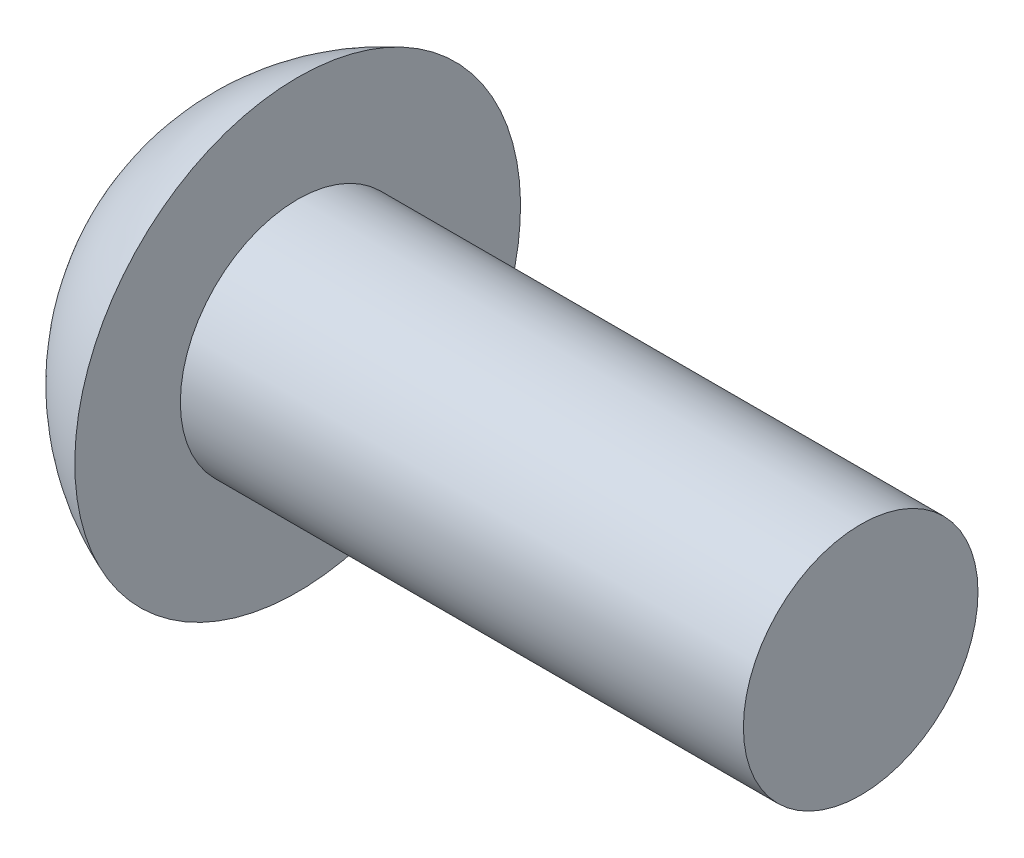
ISO-10303-21;
HEADER;
FILE_DESCRIPTION(('STEP AP214'),'2;1');
FILE_NAME('part.step','',(''),(''),'','','');
FILE_SCHEMA(('AUTOMOTIVE_DESIGN { 1 0 10303 214 1 1 1 1 }'));
ENDSEC;
DATA;
#1=APPLICATION_CONTEXT('core data for automotive mechanical design processes');
#2=APPLICATION_PROTOCOL_DEFINITION('international standard','automotive_design',2000,#1);
#3=PRODUCT_CONTEXT('',#1,'mechanical');
#4=PRODUCT('Part','Part','',(#3));
#5=PRODUCT_RELATED_PRODUCT_CATEGORY('part','',(#4));
#6=PRODUCT_DEFINITION_FORMATION('','',#4);
#7=PRODUCT_DEFINITION_CONTEXT('part definition',#1,'design');
#8=PRODUCT_DEFINITION('design','',#6,#7);
#9=PRODUCT_DEFINITION_SHAPE('','',#8);
#10=(LENGTH_UNIT() NAMED_UNIT(*) SI_UNIT(.MILLI.,.METRE.));
#11=(NAMED_UNIT(*) PLANE_ANGLE_UNIT() SI_UNIT($,.RADIAN.));
#12=(NAMED_UNIT(*) SI_UNIT($,.STERADIAN.) SOLID_ANGLE_UNIT());
#13=UNCERTAINTY_MEASURE_WITH_UNIT(LENGTH_MEASURE(1.E-05),#10,'distance_accuracy_value','');
#14=(GEOMETRIC_REPRESENTATION_CONTEXT(3) GLOBAL_UNCERTAINTY_ASSIGNED_CONTEXT((#13)) GLOBAL_UNIT_ASSIGNED_CONTEXT((#10,
#11,#12)) REPRESENTATION_CONTEXT('',''));
#15=CARTESIAN_POINT('',(0.,0.,0.));
#16=DIRECTION('',(0.,0.,1.));
#17=DIRECTION('',(1.,0.,0.));
#18=AXIS2_PLACEMENT_3D('',#15,#16,#17);
#19=CARTESIAN_POINT('',(0.,0.,0.));
#20=DIRECTION('',(1.,0.,0.));
#21=DIRECTION('',(0.,0.,-1.));
#22=AXIS2_PLACEMENT_3D('',#19,#20,#21);
#23=PLANE('',#22);
#24=CARTESIAN_POINT('',(0.,0.,0.));
#25=DIRECTION('',(-1.,0.,0.));
#26=DIRECTION('',(0.,0.,1.));
#27=AXIS2_PLACEMENT_3D('',#24,#25,#26);
#28=CIRCLE('',#27,2.22);
#29=CARTESIAN_POINT('',(0.,2.22,0.));
#30=VERTEX_POINT('',#29);
#31=EDGE_CURVE('E135',#30,#30,#28,.T.);
#32=ORIENTED_EDGE('',*,*,#31,.T.);
#33=EDGE_LOOP('',(#32));
#34=FACE_BOUND('',#33,.T.);
#35=DIRECTION('',(0.,0.866025403784439,-0.5));
#36=VECTOR('',#35,1.);
#37=CARTESIAN_POINT('',(0.,-1.5,-0.866025403784438));
#38=LINE('',#37,#36);
#39=CARTESIAN_POINT('',(0.,-1.5,-0.866025403784438));
#40=VERTEX_POINT('',#39);
#41=CARTESIAN_POINT('',(0.,0.,-1.73205080756888));
#42=VERTEX_POINT('',#41);
#43=EDGE_CURVE('E61',#40,#42,#38,.T.);
#44=ORIENTED_EDGE('',*,*,#43,.T.);
#45=DIRECTION('',(0.,0.866025403784438,0.5));
#46=VECTOR('',#45,1.);
#47=CARTESIAN_POINT('',(0.,0.,-1.73205080756888));
#48=LINE('',#47,#46);
#49=CARTESIAN_POINT('',(0.,1.5,-0.866025403784437));
#50=VERTEX_POINT('',#49);
#51=EDGE_CURVE('E120',#42,#50,#48,.T.);
#52=ORIENTED_EDGE('',*,*,#51,.T.);
#53=DIRECTION('',(0.,0.,1.));
#54=VECTOR('',#53,1.);
#55=CARTESIAN_POINT('',(0.,1.5,-0.866025403784437));
#56=LINE('',#55,#54);
#57=CARTESIAN_POINT('',(0.,1.5,0.866025403784439));
#58=VERTEX_POINT('',#57);
#59=EDGE_CURVE('E118',#50,#58,#56,.T.);
#60=ORIENTED_EDGE('',*,*,#59,.T.);
#61=DIRECTION('',(0.,-0.866025403784439,0.5));
#62=VECTOR('',#61,1.);
#63=CARTESIAN_POINT('',(0.,1.5,0.866025403784439));
#64=LINE('',#63,#62);
#65=CARTESIAN_POINT('',(0.,0.,1.73205080756888));
#66=VERTEX_POINT('',#65);
#67=EDGE_CURVE('E97',#58,#66,#64,.T.);
#68=ORIENTED_EDGE('',*,*,#67,.T.);
#69=DIRECTION('',(0.,-0.866025403784438,-0.5));
#70=VECTOR('',#69,1.);
#71=CARTESIAN_POINT('',(0.,0.,1.73205080756888));
#72=LINE('',#71,#70);
#73=CARTESIAN_POINT('',(0.,-1.5,0.866025403784439));
#74=VERTEX_POINT('',#73);
#75=EDGE_CURVE('E108',#66,#74,#72,.T.);
#76=ORIENTED_EDGE('',*,*,#75,.T.);
#77=DIRECTION('',(0.,0.,-1.));
#78=VECTOR('',#77,1.);
#79=CARTESIAN_POINT('',(0.,-1.5,0.866025403784439));
#80=LINE('',#79,#78);
#81=EDGE_CURVE('E114',#74,#40,#80,.T.);
#82=ORIENTED_EDGE('',*,*,#81,.T.);
#83=EDGE_LOOP('',(#44,#52,#60,#68,#76,#82));
#84=FACE_BOUND('',#83,.T.);
#85=ADVANCED_FACE('F47',(#34,#84),#23,.F.);
#86=CARTESIAN_POINT('',(2.75,0.,0.));
#87=DIRECTION('',(1.,0.,0.));
#88=DIRECTION('',(0.,0.,-1.));
#89=AXIS2_PLACEMENT_3D('',#86,#87,#88);
#90=PLANE('',#89);
#91=CARTESIAN_POINT('',(2.75,0.,0.));
#92=DIRECTION('',(-1.,0.,0.));
#93=DIRECTION('',(0.,0.,1.));
#94=AXIS2_PLACEMENT_3D('',#91,#92,#93);
#95=CIRCLE('',#94,4.75);
#96=CARTESIAN_POINT('',(2.75,4.75,0.));
#97=VERTEX_POINT('',#96);
#98=EDGE_CURVE('E138',#97,#97,#95,.T.);
#99=ORIENTED_EDGE('',*,*,#98,.F.);
#100=EDGE_LOOP('',(#99));
#101=FACE_BOUND('',#100,.T.);
#102=CARTESIAN_POINT('',(2.75,0.,0.));
#103=DIRECTION('',(1.,0.,0.));
#104=DIRECTION('',(0.,0.,-1.));
#105=AXIS2_PLACEMENT_3D('',#102,#103,#104);
#106=CIRCLE('',#105,2.5);
#107=CARTESIAN_POINT('',(2.75,0.,-2.5));
#108=VERTEX_POINT('',#107);
#109=EDGE_CURVE('E50',#108,#108,#106,.T.);
#110=ORIENTED_EDGE('',*,*,#109,.F.);
#111=EDGE_LOOP('',(#110));
#112=FACE_BOUND('',#111,.T.);
#113=ADVANCED_FACE('F147',(#101,#112),#90,.T.);
#114=CARTESIAN_POINT('',(14.75,0.,0.));
#115=DIRECTION('',(-1.,0.,0.));
#116=DIRECTION('',(0.,0.,1.));
#117=AXIS2_PLACEMENT_3D('',#114,#115,#116);
#118=CYLINDRICAL_SURFACE('',#117,2.5);
#119=CARTESIAN_POINT('',(14.75,0.,0.));
#120=DIRECTION('',(1.,0.,0.));
#121=DIRECTION('',(0.,0.,-1.));
#122=AXIS2_PLACEMENT_3D('',#119,#120,#121);
#123=CIRCLE('',#122,2.5);
#124=CARTESIAN_POINT('',(14.75,0.,-2.5));
#125=VERTEX_POINT('',#124);
#126=EDGE_CURVE('E13',#125,#125,#123,.T.);
#127=ORIENTED_EDGE('',*,*,#126,.F.);
#128=EDGE_LOOP('',(#127));
#129=FACE_BOUND('',#128,.T.);
#130=ORIENTED_EDGE('',*,*,#109,.T.);
#131=EDGE_LOOP('',(#130));
#132=FACE_BOUND('',#131,.T.);
#133=ADVANCED_FACE('F145',(#129,#132),#118,.T.);
#134=CARTESIAN_POINT('',(14.75,0.,0.));
#135=DIRECTION('',(1.,0.,0.));
#136=DIRECTION('',(0.,0.,-1.));
#137=AXIS2_PLACEMENT_3D('',#134,#135,#136);
#138=PLANE('',#137);
#139=ORIENTED_EDGE('',*,*,#126,.T.);
#140=EDGE_LOOP('',(#139));
#141=FACE_BOUND('',#140,.T.);
#142=ADVANCED_FACE('F154',(#141),#138,.T.);
#143=CARTESIAN_POINT('',(4.5812,0.,0.));
#144=DIRECTION('',(-1.,0.,0.));
#145=DIRECTION('',(0.,1.,0.));
#146=AXIS2_PLACEMENT_3D('',#143,#144,#145);
#147=SPHERICAL_SURFACE('',#146,5.09075568457179);
#148=CARTESIAN_POINT('',(2.75,4.75,0.));
#149=CARTESIAN_POINT('',(2.71281165914362,4.7356634067664,0.));
#150=CARTESIAN_POINT('',(2.67579175260739,4.72088991760716,0.));
#151=CARTESIAN_POINT('',(2.60210907410314,4.69047767338159,0.));
#152=CARTESIAN_POINT('',(2.56544630213512,4.67483891831526,0.));
#153=CARTESIAN_POINT('',(2.49249815869515,4.64270466821971,0.));
#154=CARTESIAN_POINT('',(2.45621278722321,4.62620917319048,0.));
#155=CARTESIAN_POINT('',(2.3840394497301,4.59237056961104,0.));
#156=CARTESIAN_POINT('',(2.34815148370892,4.57502746106082,0.));
#157=CARTESIAN_POINT('',(2.27679275699553,4.53950319018149,0.));
#158=CARTESIAN_POINT('',(2.24132199630331,4.52132202785239,0.));
#159=CARTESIAN_POINT('',(2.17081724619298,4.48413168063562,0.));
#160=CARTESIAN_POINT('',(2.13578325677486,4.46512249574795,0.));
#161=CARTESIAN_POINT('',(2.06617137523708,4.42628658893631,0.));
#162=CARTESIAN_POINT('',(2.03159348311743,4.40645986701233,0.));
#163=CARTESIAN_POINT('',(1.96291287033178,4.36599982328776,0.));
#164=CARTESIAN_POINT('',(1.92881014966579,4.34536650148717,0.));
#165=CARTESIAN_POINT('',(1.86109869189659,4.30330463993736,0.));
#166=CARTESIAN_POINT('',(1.82748995479339,4.28187610018814,0.));
#167=CARTESIAN_POINT('',(1.76078500374307,4.23823562338269,0.));
#168=CARTESIAN_POINT('',(1.72768878979595,4.21602368632645,0.));
#169=CARTESIAN_POINT('',(1.66202714193304,4.17082866768159,0.));
#170=CARTESIAN_POINT('',(1.62946170801725,4.14784558609296,0.));
#171=CARTESIAN_POINT('',(1.56487958429648,4.10112095654801,0.));
#172=CARTESIAN_POINT('',(1.5328628944915,4.0773794085917,0.));
#173=CARTESIAN_POINT('',(1.46939592036835,4.02915094286818,0.));
#174=CARTESIAN_POINT('',(1.43794563605018,4.00466402510099,0.));
#175=CARTESIAN_POINT('',(1.37562882183011,3.95495832748135,0.));
#176=CARTESIAN_POINT('',(1.34476229192821,3.9297395476289,0.));
#177=CARTESIAN_POINT('',(1.28363001345356,3.87858403728161,0.));
#178=CARTESIAN_POINT('',(1.25336426488081,3.85264730678677,0.));
#179=CARTESIAN_POINT('',(1.19345024456815,3.80007020264087,0.));
#180=CARTESIAN_POINT('',(1.16380197282824,3.77342982898982,0.));
#181=CARTESIAN_POINT('',(1.10513926106603,3.71946013416859,0.));
#182=CARTESIAN_POINT('',(1.07612482104372,3.6921308129984,0.));
#183=CARTESIAN_POINT('',(1.01874577796071,3.63679829882028,0.));
#184=CARTESIAN_POINT('',(0.990381174900008,3.60879510581234,0.));
#185=CARTESIAN_POINT('',(0.934317452514436,3.55213029536823,0.));
#186=CARTESIAN_POINT('',(0.906618333189569,3.52346867793205,0.));
#187=CARTESIAN_POINT('',(0.851900857948916,3.46550282924783,0.));
#188=CARTESIAN_POINT('',(0.824882502033129,3.43619859799978,0.));
#189=CARTESIAN_POINT('',(0.771541457754219,3.37696368679339,0.));
#190=CARTESIAN_POINT('',(0.745218769391096,3.34703300683506,0.));
#191=CARTESIAN_POINT('',(0.693283580609569,3.28656170887789,0.));
#192=CARTESIAN_POINT('',(0.667671080191165,3.25602109087906,0.));
#193=CARTESIAN_POINT('',(0.617170395930826,3.19434676397053,0.));
#194=CARTESIAN_POINT('',(0.59228221208889,3.16321305506084,0.));
#195=CARTESIAN_POINT('',(0.543243890055002,3.10036972062883,0.));
#196=CARTESIAN_POINT('',(0.51909375186305,3.06866009510651,0.));
#197=CARTESIAN_POINT('',(0.471544843086512,3.00468241943424,0.));
#198=CARTESIAN_POINT('',(0.448146072501926,2.9724143692843,0.));
#199=CARTESIAN_POINT('',(0.402112806374826,2.90733764440914,0.));
#200=CARTESIAN_POINT('',(0.379478310832312,2.87452896968392,0.));
#201=CARTESIAN_POINT('',(0.334986080796769,2.80838909384811,0.));
#202=CARTESIAN_POINT('',(0.313128346303741,2.77505789273752,0.));
#203=CARTESIAN_POINT('',(0.270201695255319,2.70789135088823,0.));
#204=CARTESIAN_POINT('',(0.249132778699925,2.67405601014954,0.));
#205=CARTESIAN_POINT('',(0.207795387646451,2.60589985268335,0.));
#206=CARTESIAN_POINT('',(0.187526913148371,2.57157903595585,0.));
#207=CARTESIAN_POINT('',(0.147801579945857,2.50247086249532,0.));
#208=CARTESIAN_POINT('',(0.128344721241424,2.46768350576228,0.));
#209=CARTESIAN_POINT('',(0.0902533786243306,2.39766142868534,0.));
#210=CARTESIAN_POINT('',(0.07161889471167,2.36242670834144,0.));
#211=CARTESIAN_POINT('',(0.0351824839700637,2.29152939046082,0.));
#212=CARTESIAN_POINT('',(0.017380557141118,2.2558667929241,0.));
#213=CARTESIAN_POINT('',(0.,2.22,0.));
#214=B_SPLINE_CURVE_WITH_KNOTS('',3,(#148,#149,#150,#151,#152,#153,#154,#155,#156,#157,#158,
#159,#160,#161,#162,#163,#164,#165,#166,#167,#168,#169,#170,#171,#172,#173,#174,#175,#176,#177,
#178,#179,#180,#181,#182,#183,#184,#185,#186,#187,#188,#189,#190,#191,#192,#193,#194,#195,#196,
#197,#198,#199,#200,#201,#202,#203,#204,#205,#206,#207,#208,#209,#210,#211,#212,#213),
.UNSPECIFIED.,.F.,.F.,(4,2,2,2,2,2,2,2,2,2,2,2,2,2,2,2,2,2,2,2,2,2,2,2,2,2,2,2,2,2,2,2,4),(0.,
0.119565616611756,0.239131233223512,0.358696849835268,0.478262466447023,0.59782808305878,
0.717393699670535,0.836959316282291,0.956524932894048,1.0760905495058,1.19565616611756,
1.31522178272932,1.43478739934107,1.55435301595283,1.67391863256458,1.79348424917634,
1.91304986578809,2.03261548239985,2.15218109901161,2.27174671562336,2.39131233223512,
2.51087794884687,2.63044356545863,2.75000918207039,2.86957479868214,2.9891404152939,
3.10870603190565,3.22827164851741,3.34783726512917,3.46740288174092,3.58696849835268,
3.70653411496443,3.82609973157619),.UNSPECIFIED.);
#215=EDGE_CURVE('BSEAM161',#97,#30,#214,.T.);
#216=ORIENTED_EDGE('',*,*,#98,.T.);
#217=ORIENTED_EDGE('',*,*,#31,.F.);
#218=ORIENTED_EDGE('',*,*,#215,.T.);
#219=ORIENTED_EDGE('',*,*,#215,.F.);
#220=EDGE_LOOP('',(#216,#218,#217,#219));
#221=FACE_BOUND('',#220,.T.);
#222=ADVANCED_FACE('F161',(#221),#147,.T.);
#223=CARTESIAN_POINT('',(1.56,-1.5,-0.866025403784438));
#224=DIRECTION('',(0.,0.5,0.866025403784439));
#225=DIRECTION('',(0.,-0.866025403784439,0.5));
#226=AXIS2_PLACEMENT_3D('',#223,#224,#225);
#227=PLANE('',#226);
#228=ORIENTED_EDGE('',*,*,#43,.F.);
#229=DIRECTION('',(-1.,0.,0.));
#230=VECTOR('',#229,1.);
#231=CARTESIAN_POINT('',(1.56,-1.5,-0.866025403784438));
#232=LINE('',#231,#230);
#233=CARTESIAN_POINT('',(1.56,-1.5,-0.866025403784438));
#234=VERTEX_POINT('',#233);
#235=EDGE_CURVE('E126',#234,#40,#232,.T.);
#236=ORIENTED_EDGE('',*,*,#235,.F.);
#237=DIRECTION('',(0.,0.866025403784439,-0.5));
#238=VECTOR('',#237,1.);
#239=CARTESIAN_POINT('',(1.56,-1.5,-0.866025403784438));
#240=LINE('',#239,#238);
#241=CARTESIAN_POINT('',(1.56,0.,-1.73205080756888));
#242=VERTEX_POINT('',#241);
#243=EDGE_CURVE('E125',#234,#242,#240,.T.);
#244=ORIENTED_EDGE('',*,*,#243,.T.);
#245=DIRECTION('',(-1.,0.,0.));
#246=VECTOR('',#245,1.);
#247=CARTESIAN_POINT('',(1.56,0.,-1.73205080756888));
#248=LINE('',#247,#246);
#249=EDGE_CURVE('E133',#242,#42,#248,.T.);
#250=ORIENTED_EDGE('',*,*,#249,.T.);
#251=EDGE_LOOP('',(#228,#236,#244,#250));
#252=FACE_BOUND('',#251,.T.);
#253=ADVANCED_FACE('F165',(#252),#227,.T.);
#254=CARTESIAN_POINT('',(1.56,0.,-1.73205080756888));
#255=DIRECTION('',(0.,-0.5,0.866025403784438));
#256=DIRECTION('',(0.,-0.866025403784439,-0.5));
#257=AXIS2_PLACEMENT_3D('',#254,#255,#256);
#258=PLANE('',#257);
#259=ORIENTED_EDGE('',*,*,#51,.F.);
#260=ORIENTED_EDGE('',*,*,#249,.F.);
#261=DIRECTION('',(0.,0.866025403784438,0.5));
#262=VECTOR('',#261,1.);
#263=CARTESIAN_POINT('',(1.56,0.,-1.73205080756888));
#264=LINE('',#263,#262);
#265=CARTESIAN_POINT('',(1.56,1.5,-0.866025403784437));
#266=VERTEX_POINT('',#265);
#267=EDGE_CURVE('E236',#242,#266,#264,.T.);
#268=ORIENTED_EDGE('',*,*,#267,.T.);
#269=DIRECTION('',(-1.,0.,0.));
#270=VECTOR('',#269,1.);
#271=CARTESIAN_POINT('',(1.56,1.5,-0.866025403784437));
#272=LINE('',#271,#270);
#273=EDGE_CURVE('E131',#266,#50,#272,.T.);
#274=ORIENTED_EDGE('',*,*,#273,.T.);
#275=EDGE_LOOP('',(#259,#260,#268,#274));
#276=FACE_BOUND('',#275,.T.);
#277=ADVANCED_FACE('F168',(#276),#258,.T.);
#278=CARTESIAN_POINT('',(1.56,1.5,-0.866025403784437));
#279=DIRECTION('',(0.,-1.,0.));
#280=DIRECTION('',(0.,0.,-1.));
#281=AXIS2_PLACEMENT_3D('',#278,#279,#280);
#282=PLANE('',#281);
#283=ORIENTED_EDGE('',*,*,#59,.F.);
#284=ORIENTED_EDGE('',*,*,#273,.F.);
#285=DIRECTION('',(0.,0.,1.));
#286=VECTOR('',#285,1.);
#287=CARTESIAN_POINT('',(1.56,1.5,-0.866025403784437));
#288=LINE('',#287,#286);
#289=CARTESIAN_POINT('',(1.56,1.5,0.866025403784439));
#290=VERTEX_POINT('',#289);
#291=EDGE_CURVE('E70',#266,#290,#288,.T.);
#292=ORIENTED_EDGE('',*,*,#291,.T.);
#293=DIRECTION('',(-1.,0.,0.));
#294=VECTOR('',#293,1.);
#295=CARTESIAN_POINT('',(1.56,1.5,0.866025403784439));
#296=LINE('',#295,#294);
#297=EDGE_CURVE('E104',#290,#58,#296,.T.);
#298=ORIENTED_EDGE('',*,*,#297,.T.);
#299=EDGE_LOOP('',(#283,#284,#292,#298));
#300=FACE_BOUND('',#299,.T.);
#301=ADVANCED_FACE('F171',(#300),#282,.T.);
#302=CARTESIAN_POINT('',(1.56,1.5,0.866025403784439));
#303=DIRECTION('',(0.,-0.5,-0.866025403784439));
#304=DIRECTION('',(0.,0.866025403784439,-0.5));
#305=AXIS2_PLACEMENT_3D('',#302,#303,#304);
#306=PLANE('',#305);
#307=ORIENTED_EDGE('',*,*,#67,.F.);
#308=ORIENTED_EDGE('',*,*,#297,.F.);
#309=DIRECTION('',(0.,-0.866025403784439,0.5));
#310=VECTOR('',#309,1.);
#311=CARTESIAN_POINT('',(1.56,1.5,0.866025403784439));
#312=LINE('',#311,#310);
#313=CARTESIAN_POINT('',(1.56,0.,1.73205080756888));
#314=VERTEX_POINT('',#313);
#315=EDGE_CURVE('E101',#290,#314,#312,.T.);
#316=ORIENTED_EDGE('',*,*,#315,.T.);
#317=DIRECTION('',(-1.,0.,0.));
#318=VECTOR('',#317,1.);
#319=CARTESIAN_POINT('',(1.56,0.,1.73205080756888));
#320=LINE('',#319,#318);
#321=EDGE_CURVE('E92',#314,#66,#320,.T.);
#322=ORIENTED_EDGE('',*,*,#321,.T.);
#323=EDGE_LOOP('',(#307,#308,#316,#322));
#324=FACE_BOUND('',#323,.T.);
#325=ADVANCED_FACE('F94',(#324),#306,.T.);
#326=CARTESIAN_POINT('',(1.56,0.,1.73205080756888));
#327=DIRECTION('',(0.,0.5,-0.866025403784438));
#328=DIRECTION('',(0.,0.866025403784439,0.5));
#329=AXIS2_PLACEMENT_3D('',#326,#327,#328);
#330=PLANE('',#329);
#331=ORIENTED_EDGE('',*,*,#75,.F.);
#332=ORIENTED_EDGE('',*,*,#321,.F.);
#333=DIRECTION('',(0.,-0.866025403784438,-0.5));
#334=VECTOR('',#333,1.);
#335=CARTESIAN_POINT('',(1.56,0.,1.73205080756888));
#336=LINE('',#335,#334);
#337=CARTESIAN_POINT('',(1.56,-1.5,0.866025403784439));
#338=VERTEX_POINT('',#337);
#339=EDGE_CURVE('E211',#314,#338,#336,.T.);
#340=ORIENTED_EDGE('',*,*,#339,.T.);
#341=DIRECTION('',(-1.,0.,0.));
#342=VECTOR('',#341,1.);
#343=CARTESIAN_POINT('',(1.56,-1.5,0.866025403784439));
#344=LINE('',#343,#342);
#345=EDGE_CURVE('E105',#338,#74,#344,.T.);
#346=ORIENTED_EDGE('',*,*,#345,.T.);
#347=EDGE_LOOP('',(#331,#332,#340,#346));
#348=FACE_BOUND('',#347,.T.);
#349=ADVANCED_FACE('F109',(#348),#330,.T.);
#350=CARTESIAN_POINT('',(1.56,-1.5,0.866025403784439));
#351=DIRECTION('',(0.,1.,0.));
#352=DIRECTION('',(0.,0.,1.));
#353=AXIS2_PLACEMENT_3D('',#350,#351,#352);
#354=PLANE('',#353);
#355=ORIENTED_EDGE('',*,*,#81,.F.);
#356=ORIENTED_EDGE('',*,*,#345,.F.);
#357=DIRECTION('',(0.,0.,-1.));
#358=VECTOR('',#357,1.);
#359=CARTESIAN_POINT('',(1.56,-1.5,0.866025403784439));
#360=LINE('',#359,#358);
#361=EDGE_CURVE('E128',#338,#234,#360,.T.);
#362=ORIENTED_EDGE('',*,*,#361,.T.);
#363=ORIENTED_EDGE('',*,*,#235,.T.);
#364=EDGE_LOOP('',(#355,#356,#362,#363));
#365=FACE_BOUND('',#364,.T.);
#366=ADVANCED_FACE('F180',(#365),#354,.T.);
#367=CARTESIAN_POINT('',(1.56,0.,1.73205080756888));
#368=DIRECTION('',(0.86602540378444,-0.249999999999999,0.433012701892218));
#369=DIRECTION('',(0.447213595499956,0.,-0.894427190999917));
#370=AXIS2_PLACEMENT_3D('',#367,#368,#369);
#371=PLANE('',#370);
#372=ORIENTED_EDGE('',*,*,#339,.F.);
#373=DIRECTION('',(-0.447213595499956,0.,0.894427190999917));
#374=VECTOR('',#373,1.);
#375=CARTESIAN_POINT('',(1.56,0.,1.73205080756888));
#376=LINE('',#375,#374);
#377=CARTESIAN_POINT('',(2.42602540378443,0.,0.));
#378=VERTEX_POINT('',#377);
#379=EDGE_CURVE('E213',#378,#314,#376,.T.);
#380=ORIENTED_EDGE('',*,*,#379,.F.);
#381=DIRECTION('',(-0.447213595499956,-0.774596669241484,0.447213595499958));
#382=VECTOR('',#381,1.);
#383=CARTESIAN_POINT('',(1.56,-1.5,0.866025403784439));
#384=LINE('',#383,#382);
#385=EDGE_CURVE('E216',#378,#338,#384,.T.);
#386=ORIENTED_EDGE('',*,*,#385,.T.);
#387=EDGE_LOOP('',(#372,#380,#386));
#388=FACE_BOUND('',#387,.T.);
#389=ADVANCED_FACE('F183',(#388),#371,.F.);
#390=CARTESIAN_POINT('',(1.56,-1.5,0.866025403784439));
#391=DIRECTION('',(0.86602540378444,-0.499999999999998,0.));
#392=DIRECTION('',(0.499999999999998,0.86602540378444,0.));
#393=AXIS2_PLACEMENT_3D('',#390,#391,#392);
#394=PLANE('',#393);
#395=ORIENTED_EDGE('',*,*,#361,.F.);
#396=ORIENTED_EDGE('',*,*,#385,.F.);
#397=DIRECTION('',(-0.447213595499956,-0.774596669241484,-0.447213595499958));
#398=VECTOR('',#397,1.);
#399=CARTESIAN_POINT('',(1.56,-1.5,-0.866025403784438));
#400=LINE('',#399,#398);
#401=EDGE_CURVE('E240',#378,#234,#400,.T.);
#402=ORIENTED_EDGE('',*,*,#401,.T.);
#403=EDGE_LOOP('',(#395,#396,#402));
#404=FACE_BOUND('',#403,.T.);
#405=ADVANCED_FACE('F185',(#404),#394,.F.);
#406=CARTESIAN_POINT('',(1.56,-1.5,-0.866025403784438));
#407=DIRECTION('',(0.86602540378444,-0.249999999999999,-0.433012701892218));
#408=DIRECTION('',(-0.447213595499956,0.,-0.894427190999917));
#409=AXIS2_PLACEMENT_3D('',#406,#407,#408);
#410=PLANE('',#409);
#411=ORIENTED_EDGE('',*,*,#243,.F.);
#412=ORIENTED_EDGE('',*,*,#401,.F.);
#413=DIRECTION('',(-0.447213595499956,0.,-0.894427190999917));
#414=VECTOR('',#413,1.);
#415=CARTESIAN_POINT('',(1.56,0.,-1.73205080756888));
#416=LINE('',#415,#414);
#417=EDGE_CURVE('E248',#378,#242,#416,.T.);
#418=ORIENTED_EDGE('',*,*,#417,.T.);
#419=EDGE_LOOP('',(#411,#412,#418));
#420=FACE_BOUND('',#419,.T.);
#421=ADVANCED_FACE('F188',(#420),#410,.F.);
#422=CARTESIAN_POINT('',(1.56,0.,-1.73205080756888));
#423=DIRECTION('',(0.86602540378444,0.249999999999999,-0.433012701892218));
#424=DIRECTION('',(-0.447213595499956,0.,-0.894427190999917));
#425=AXIS2_PLACEMENT_3D('',#422,#423,#424);
#426=PLANE('',#425);
#427=ORIENTED_EDGE('',*,*,#267,.F.);
#428=ORIENTED_EDGE('',*,*,#417,.F.);
#429=DIRECTION('',(-0.447213595499956,0.774596669241484,-0.447213595499958));
#430=VECTOR('',#429,1.);
#431=CARTESIAN_POINT('',(1.56,1.5,-0.866025403784437));
#432=LINE('',#431,#430);
#433=EDGE_CURVE('E250',#378,#266,#432,.T.);
#434=ORIENTED_EDGE('',*,*,#433,.T.);
#435=EDGE_LOOP('',(#427,#428,#434));
#436=FACE_BOUND('',#435,.T.);
#437=ADVANCED_FACE('F192',(#436),#426,.F.);
#438=CARTESIAN_POINT('',(1.56,1.5,-0.866025403784437));
#439=DIRECTION('',(0.86602540378444,0.499999999999998,0.));
#440=DIRECTION('',(-0.499999999999998,0.86602540378444,0.));
#441=AXIS2_PLACEMENT_3D('',#438,#439,#440);
#442=PLANE('',#441);
#443=ORIENTED_EDGE('',*,*,#291,.F.);
#444=ORIENTED_EDGE('',*,*,#433,.F.);
#445=DIRECTION('',(-0.447213595499956,0.774596669241484,0.447213595499958));
#446=VECTOR('',#445,1.);
#447=CARTESIAN_POINT('',(1.56,1.5,0.866025403784439));
#448=LINE('',#447,#446);
#449=EDGE_CURVE('E244',#378,#290,#448,.T.);
#450=ORIENTED_EDGE('',*,*,#449,.T.);
#451=EDGE_LOOP('',(#443,#444,#450));
#452=FACE_BOUND('',#451,.T.);
#453=ADVANCED_FACE('F196',(#452),#442,.F.);
#454=CARTESIAN_POINT('',(1.56,1.5,0.866025403784439));
#455=DIRECTION('',(0.86602540378444,0.249999999999999,0.433012701892218));
#456=DIRECTION('',(0.447213595499956,0.,-0.894427190999917));
#457=AXIS2_PLACEMENT_3D('',#454,#455,#456);
#458=PLANE('',#457);
#459=ORIENTED_EDGE('',*,*,#315,.F.);
#460=ORIENTED_EDGE('',*,*,#449,.F.);
#461=ORIENTED_EDGE('',*,*,#379,.T.);
#462=EDGE_LOOP('',(#459,#460,#461));
#463=FACE_BOUND('',#462,.T.);
#464=ADVANCED_FACE('F200',(#463),#458,.F.);
#465=CLOSED_SHELL('',(#85,#113,#133,#142,#222,#253,#277,#301,#325,#349,#366,#389,#405,#421,#437,
#453,#464));
#466=MANIFOLD_SOLID_BREP('B2',#465);
#467=ADVANCED_BREP_SHAPE_REPRESENTATION('',(#18,#466),#14);
#468=SHAPE_DEFINITION_REPRESENTATION(#9,#467);
ENDSEC;
END-ISO-10303-21;
